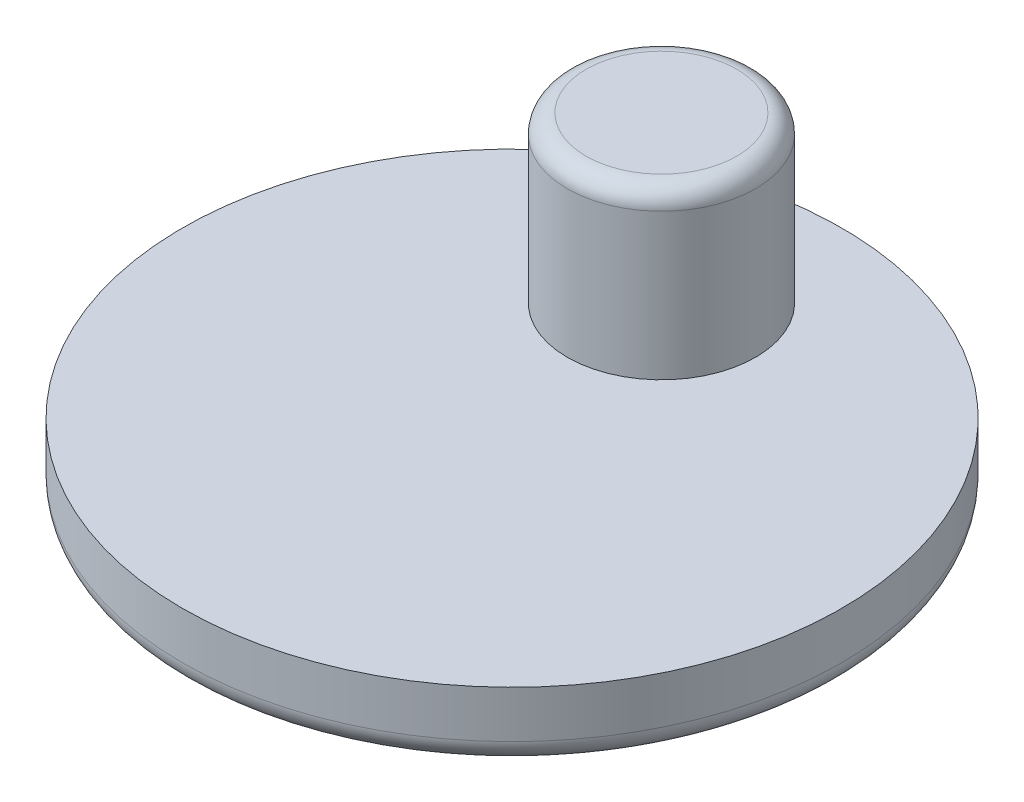
ISO-10303-21;
HEADER;
FILE_DESCRIPTION(('STEP AP214'),'2;1');
FILE_NAME('part.step','',(''),(''),'','','');
FILE_SCHEMA(('AUTOMOTIVE_DESIGN { 1 0 10303 214 1 1 1 1 }'));
ENDSEC;
DATA;
#1=APPLICATION_CONTEXT('core data for automotive mechanical design processes');
#2=APPLICATION_PROTOCOL_DEFINITION('international standard','automotive_design',2000,#1);
#3=PRODUCT_CONTEXT('',#1,'mechanical');
#4=PRODUCT('Part','Part','',(#3));
#5=PRODUCT_RELATED_PRODUCT_CATEGORY('part','',(#4));
#6=PRODUCT_DEFINITION_FORMATION('','',#4);
#7=PRODUCT_DEFINITION_CONTEXT('part definition',#1,'design');
#8=PRODUCT_DEFINITION('design','',#6,#7);
#9=PRODUCT_DEFINITION_SHAPE('','',#8);
#10=(LENGTH_UNIT() NAMED_UNIT(*) SI_UNIT(.MILLI.,.METRE.));
#11=(NAMED_UNIT(*) PLANE_ANGLE_UNIT() SI_UNIT($,.RADIAN.));
#12=(NAMED_UNIT(*) SI_UNIT($,.STERADIAN.) SOLID_ANGLE_UNIT());
#13=UNCERTAINTY_MEASURE_WITH_UNIT(LENGTH_MEASURE(1.E-05),#10,'distance_accuracy_value','');
#14=(GEOMETRIC_REPRESENTATION_CONTEXT(3) GLOBAL_UNCERTAINTY_ASSIGNED_CONTEXT((#13)) GLOBAL_UNIT_ASSIGNED_CONTEXT((#10,
#11,#12)) REPRESENTATION_CONTEXT('',''));
#15=CARTESIAN_POINT('',(0.,0.,0.));
#16=DIRECTION('',(0.,0.,1.));
#17=DIRECTION('',(1.,0.,0.));
#18=AXIS2_PLACEMENT_3D('',#15,#16,#17);
#19=CARTESIAN_POINT('',(0.,0.5,0.));
#20=DIRECTION('',(0.,1.,0.));
#21=DIRECTION('',(0.,0.,1.));
#22=AXIS2_PLACEMENT_3D('',#19,#20,#21);
#23=TOROIDAL_SURFACE('',#22,6.5,0.5);
#24=CARTESIAN_POINT('',(0.,0.,0.));
#25=DIRECTION('',(0.,1.,0.));
#26=DIRECTION('',(0.,0.,1.));
#27=AXIS2_PLACEMENT_3D('',#24,#25,#26);
#28=CIRCLE('',#27,6.5);
#29=CARTESIAN_POINT('',(0.,0.,6.5));
#30=VERTEX_POINT('',#29);
#31=EDGE_CURVE('E45',#30,#30,#28,.F.);
#32=ORIENTED_EDGE('',*,*,#31,.F.);
#33=EDGE_LOOP('',(#32));
#34=FACE_BOUND('',#33,.T.);
#35=CARTESIAN_POINT('',(0.,0.5,0.));
#36=DIRECTION('',(0.,1.,0.));
#37=DIRECTION('',(0.,0.,1.));
#38=AXIS2_PLACEMENT_3D('',#35,#36,#37);
#39=CIRCLE('',#38,7.);
#40=CARTESIAN_POINT('',(0.,0.5,7.));
#41=VERTEX_POINT('',#40);
#42=EDGE_CURVE('E10',#41,#41,#39,.T.);
#43=ORIENTED_EDGE('',*,*,#42,.F.);
#44=EDGE_LOOP('',(#43));
#45=FACE_BOUND('',#44,.T.);
#46=ADVANCED_FACE('F39',(#34,#45),#23,.T.);
#47=CARTESIAN_POINT('',(-0.532713009058342,4.6,-3.70536463734084));
#48=DIRECTION('',(0.,1.,0.));
#49=DIRECTION('',(0.,0.,1.));
#50=AXIS2_PLACEMENT_3D('',#47,#48,#49);
#51=TOROIDAL_SURFACE('',#50,1.6,0.4);
#52=CARTESIAN_POINT('',(-0.532713009058342,5.,-3.70536463734084));
#53=DIRECTION('',(0.,1.,0.));
#54=DIRECTION('',(0.,0.,1.));
#55=AXIS2_PLACEMENT_3D('',#52,#53,#54);
#56=CIRCLE('',#55,1.6);
#57=CARTESIAN_POINT('',(-0.532713009058342,5.,-2.10536463734084));
#58=VERTEX_POINT('',#57);
#59=EDGE_CURVE('E53',#58,#58,#56,.T.);
#60=ORIENTED_EDGE('',*,*,#59,.F.);
#61=EDGE_LOOP('',(#60));
#62=FACE_BOUND('',#61,.T.);
#63=CARTESIAN_POINT('',(-0.532713009058342,4.6,-3.70536463734084));
#64=DIRECTION('',(0.,1.,0.));
#65=DIRECTION('',(0.,0.,1.));
#66=AXIS2_PLACEMENT_3D('',#63,#64,#65);
#67=CIRCLE('',#66,2.);
#68=CARTESIAN_POINT('',(-0.532713009058342,4.6,-1.70536463734084));
#69=VERTEX_POINT('',#68);
#70=EDGE_CURVE('E49',#69,#69,#67,.F.);
#71=ORIENTED_EDGE('',*,*,#70,.F.);
#72=EDGE_LOOP('',(#71));
#73=FACE_BOUND('',#72,.T.);
#74=ADVANCED_FACE('F76',(#62,#73),#51,.T.);
#75=CARTESIAN_POINT('',(0.,1.5,0.));
#76=DIRECTION('',(0.,-1.,0.));
#77=DIRECTION('',(0.,0.,-1.));
#78=AXIS2_PLACEMENT_3D('',#75,#76,#77);
#79=CYLINDRICAL_SURFACE('',#78,7.);
#80=ORIENTED_EDGE('',*,*,#42,.T.);
#81=EDGE_LOOP('',(#80));
#82=FACE_BOUND('',#81,.T.);
#83=CARTESIAN_POINT('',(0.,1.5,0.));
#84=DIRECTION('',(0.,1.,0.));
#85=DIRECTION('',(0.,0.,1.));
#86=AXIS2_PLACEMENT_3D('',#83,#84,#85);
#87=CIRCLE('',#86,7.);
#88=CARTESIAN_POINT('',(0.,1.5,7.));
#89=VERTEX_POINT('',#88);
#90=EDGE_CURVE('E58',#89,#89,#87,.T.);
#91=ORIENTED_EDGE('',*,*,#90,.F.);
#92=EDGE_LOOP('',(#91));
#93=FACE_BOUND('',#92,.T.);
#94=ADVANCED_FACE('F71',(#82,#93),#79,.T.);
#95=CARTESIAN_POINT('',(0.,1.5,0.));
#96=DIRECTION('',(0.,1.,0.));
#97=DIRECTION('',(0.,0.,1.));
#98=AXIS2_PLACEMENT_3D('',#95,#96,#97);
#99=PLANE('',#98);
#100=CARTESIAN_POINT('',(-0.532713009058342,1.5,-3.70536463734084));
#101=DIRECTION('',(0.,1.,0.));
#102=DIRECTION('',(0.,0.,1.));
#103=AXIS2_PLACEMENT_3D('',#100,#101,#102);
#104=CIRCLE('',#103,2.);
#105=CARTESIAN_POINT('',(-0.532713009058342,1.5,-1.70536463734084));
#106=VERTEX_POINT('',#105);
#107=EDGE_CURVE('E61',#106,#106,#104,.T.);
#108=ORIENTED_EDGE('',*,*,#107,.F.);
#109=EDGE_LOOP('',(#108));
#110=FACE_BOUND('',#109,.T.);
#111=ORIENTED_EDGE('',*,*,#90,.T.);
#112=EDGE_LOOP('',(#111));
#113=FACE_BOUND('',#112,.T.);
#114=ADVANCED_FACE('F67',(#110,#113),#99,.T.);
#115=CARTESIAN_POINT('',(0.,0.,0.));
#116=DIRECTION('',(0.,1.,0.));
#117=DIRECTION('',(0.,0.,1.));
#118=AXIS2_PLACEMENT_3D('',#115,#116,#117);
#119=PLANE('',#118);
#120=ORIENTED_EDGE('',*,*,#31,.T.);
#121=EDGE_LOOP('',(#120));
#122=FACE_BOUND('',#121,.T.);
#123=ADVANCED_FACE('F70',(#122),#119,.F.);
#124=CARTESIAN_POINT('',(-0.532713009058342,5.,-3.70536463734084));
#125=DIRECTION('',(0.,-1.,0.));
#126=DIRECTION('',(0.,0.,-1.));
#127=AXIS2_PLACEMENT_3D('',#124,#125,#126);
#128=CYLINDRICAL_SURFACE('',#127,2.);
#129=ORIENTED_EDGE('',*,*,#70,.T.);
#130=EDGE_LOOP('',(#129));
#131=FACE_BOUND('',#130,.T.);
#132=ORIENTED_EDGE('',*,*,#107,.T.);
#133=EDGE_LOOP('',(#132));
#134=FACE_BOUND('',#133,.T.);
#135=ADVANCED_FACE('F65',(#131,#134),#128,.T.);
#136=CARTESIAN_POINT('',(-0.532713009058342,5.,-3.70536463734084));
#137=DIRECTION('',(0.,1.,0.));
#138=DIRECTION('',(0.,0.,1.));
#139=AXIS2_PLACEMENT_3D('',#136,#137,#138);
#140=PLANE('',#139);
#141=ORIENTED_EDGE('',*,*,#59,.T.);
#142=EDGE_LOOP('',(#141));
#143=FACE_BOUND('',#142,.T.);
#144=ADVANCED_FACE('F106',(#143),#140,.T.);
#145=CLOSED_SHELL('',(#46,#74,#94,#114,#123,#135,#144));
#146=MANIFOLD_SOLID_BREP('B2',#145);
#147=ADVANCED_BREP_SHAPE_REPRESENTATION('',(#18,#146),#14);
#148=SHAPE_DEFINITION_REPRESENTATION(#9,#147);
ENDSEC;
END-ISO-10303-21;
